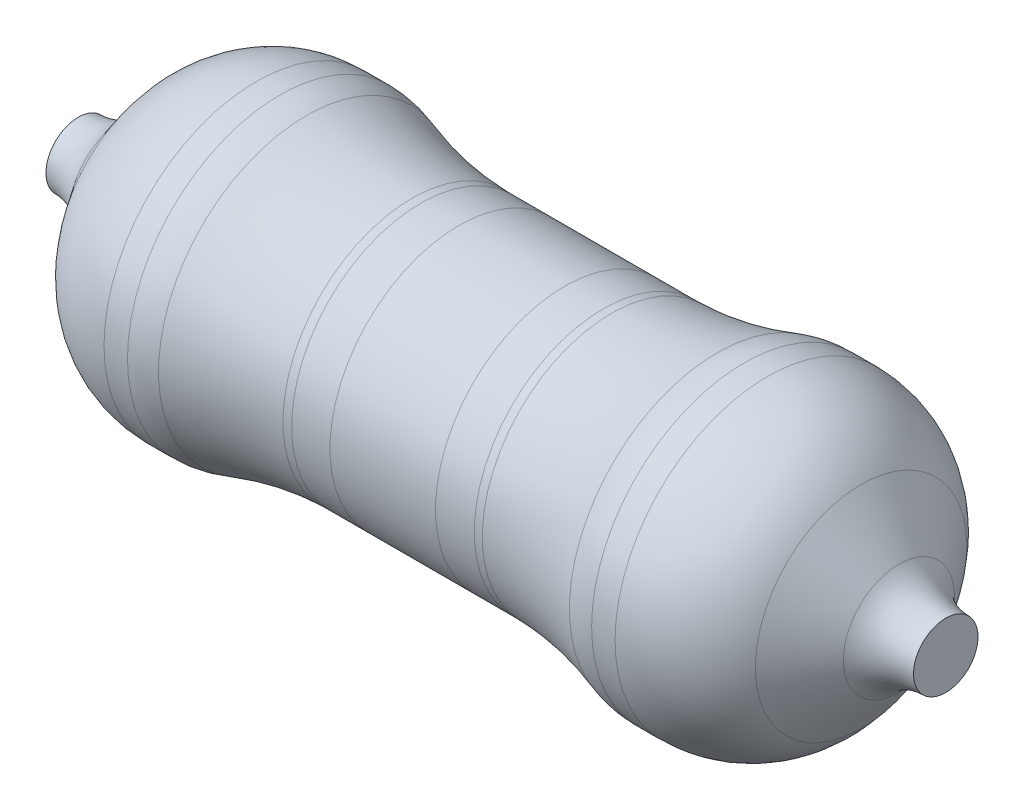
ISO-10303-21;
HEADER;
FILE_DESCRIPTION(('STEP AP214'),'2;1');
FILE_NAME('part.step','',(''),(''),'','','');
FILE_SCHEMA(('AUTOMOTIVE_DESIGN { 1 0 10303 214 1 1 1 1 }'));
ENDSEC;
DATA;
#1=APPLICATION_CONTEXT('core data for automotive mechanical design processes');
#2=APPLICATION_PROTOCOL_DEFINITION('international standard','automotive_design',2000,#1);
#3=PRODUCT_CONTEXT('',#1,'mechanical');
#4=PRODUCT('Part','Part','',(#3));
#5=PRODUCT_RELATED_PRODUCT_CATEGORY('part','',(#4));
#6=PRODUCT_DEFINITION_FORMATION('','',#4);
#7=PRODUCT_DEFINITION_CONTEXT('part definition',#1,'design');
#8=PRODUCT_DEFINITION('design','',#6,#7);
#9=PRODUCT_DEFINITION_SHAPE('','',#8);
#10=(LENGTH_UNIT() NAMED_UNIT(*) SI_UNIT(.MILLI.,.METRE.));
#11=(NAMED_UNIT(*) PLANE_ANGLE_UNIT() SI_UNIT($,.RADIAN.));
#12=(NAMED_UNIT(*) SI_UNIT($,.STERADIAN.) SOLID_ANGLE_UNIT());
#13=UNCERTAINTY_MEASURE_WITH_UNIT(LENGTH_MEASURE(1.E-05),#10,'distance_accuracy_value','');
#14=(GEOMETRIC_REPRESENTATION_CONTEXT(3) GLOBAL_UNCERTAINTY_ASSIGNED_CONTEXT((#13)) GLOBAL_UNIT_ASSIGNED_CONTEXT((#10,
#11,#12)) REPRESENTATION_CONTEXT('',''));
#15=CARTESIAN_POINT('',(0.,0.,0.));
#16=DIRECTION('',(0.,0.,1.));
#17=DIRECTION('',(1.,0.,0.));
#18=AXIS2_PLACEMENT_3D('',#15,#16,#17);
#19=CARTESIAN_POINT('',(5.85905244158813,0.,1.4));
#20=DIRECTION('',(1.,0.,0.));
#21=DIRECTION('',(0.,0.,-1.));
#22=AXIS2_PLACEMENT_3D('',#19,#20,#21);
#23=TOROIDAL_SURFACE('',#22,4.1,3.);
#24=CARTESIAN_POINT('',(6.83202541456111,0.,0.137837837837836));
#25=CARTESIAN_POINT('',(6.61399342152517,0.,0.212591664021587));
#26=CARTESIAN_POINT('',(6.38829802505005,0.,0.265011332011033));
#27=CARTESIAN_POINT('',(6.15840471411884,0.,0.293912874725487));
#28=CARTESIAN_POINT('',(5.92797458543889,0.,0.299208185186053));
#29=B_SPLINE_CURVE_WITH_KNOTS('',4,(#24,#25,#26,#27,#28),.UNSPECIFIED.,.F.,.F.,(5,5),
(2.81129529876054,3.11861658418262),.UNSPECIFIED.);
#30=CARTESIAN_POINT('',(6.83202541456111,0.,0.137837837837838));
#31=VERTEX_POINT('',#30);
#32=CARTESIAN_POINT('',(5.92797458543889,0.,0.299208185186053));
#33=VERTEX_POINT('',#32);
#34=EDGE_CURVE('E11',#31,#33,#29,.T.);
#35=ORIENTED_EDGE('',*,*,#34,.T.);
#36=CARTESIAN_POINT('',(5.92797458543889,0.,1.4));
#37=DIRECTION('',(1.,0.,0.));
#38=DIRECTION('',(0.,0.,-1.));
#39=AXIS2_PLACEMENT_3D('',#36,#37,#38);
#40=CIRCLE('',#39,1.10079181481395);
#41=EDGE_CURVE('E26',#33,#33,#40,.T.);
#42=ORIENTED_EDGE('',*,*,#41,.T.);
#43=ORIENTED_EDGE('',*,*,#34,.F.);
#44=CARTESIAN_POINT('',(6.83202541456111,0.,1.4));
#45=DIRECTION('',(1.,0.,0.));
#46=DIRECTION('',(0.,0.,-1.));
#47=AXIS2_PLACEMENT_3D('',#44,#45,#46);
#48=CIRCLE('',#47,1.26216216216216);
#49=EDGE_CURVE('E37',#31,#31,#48,.T.);
#50=ORIENTED_EDGE('',*,*,#49,.F.);
#51=EDGE_LOOP('',(#35,#42,#43,#50));
#52=FACE_BOUND('',#51,.T.);
#53=ADVANCED_FACE('F17',(#52),#23,.F.);
#54=CARTESIAN_POINT('',(5.85905244158813,0.,1.4));
#55=DIRECTION('',(1.,0.,0.));
#56=DIRECTION('',(0.,0.,-1.));
#57=AXIS2_PLACEMENT_3D('',#54,#55,#56);
#58=TOROIDAL_SURFACE('',#57,4.1,3.);
#59=CARTESIAN_POINT('',(5.92797458543889,0.,0.299208185186053));
#60=CARTESIAN_POINT('',(5.90500458029576,0.,0.299736038506322));
#61=CARTESIAN_POINT('',(5.8820285109953,0.,0.3));
#62=CARTESIAN_POINT('',(5.85905244158813,0.,0.3));
#63=B_SPLINE_CURVE_WITH_KNOTS('',3,(#59,#60,#61,#62),.UNSPECIFIED.,.F.,.F.,(4,4),
(3.11861658418262,3.14159265358979),.UNSPECIFIED.);
#64=CARTESIAN_POINT('',(5.85905244158813,0.,0.3));
#65=VERTEX_POINT('',#64);
#66=EDGE_CURVE('E250',#33,#65,#63,.T.);
#67=ORIENTED_EDGE('',*,*,#66,.T.);
#68=CARTESIAN_POINT('',(5.85905244158813,0.,1.4));
#69=DIRECTION('',(1.,0.,0.));
#70=DIRECTION('',(0.,0.,-1.));
#71=AXIS2_PLACEMENT_3D('',#68,#69,#70);
#72=CIRCLE('',#71,1.1);
#73=EDGE_CURVE('E247',#65,#65,#72,.T.);
#74=ORIENTED_EDGE('',*,*,#73,.T.);
#75=ORIENTED_EDGE('',*,*,#66,.F.);
#76=ORIENTED_EDGE('',*,*,#41,.F.);
#77=EDGE_LOOP('',(#67,#74,#75,#76));
#78=FACE_BOUND('',#77,.T.);
#79=ADVANCED_FACE('F260',(#78),#58,.F.);
#80=CARTESIAN_POINT('',(7.05905244158813,0.,1.4));
#81=DIRECTION('',(1.,0.,0.));
#82=DIRECTION('',(0.,0.,-1.));
#83=AXIS2_PLACEMENT_3D('',#80,#81,#82);
#84=DEGENERATE_TOROIDAL_SURFACE('',#83,0.600000000000001,0.7,.T.);
#85=CARTESIAN_POINT('',(7.05905244158813,0.,1.4));
#86=DIRECTION('',(1.,0.,0.));
#87=DIRECTION('',(0.,0.,-1.));
#88=AXIS2_PLACEMENT_3D('',#85,#86,#87);
#89=CIRCLE('',#88,1.3);
#90=CARTESIAN_POINT('',(7.05905244158813,0.,0.0999999999999998));
#91=VERTEX_POINT('',#90);
#92=EDGE_CURVE('E242',#91,#91,#89,.T.);
#93=ORIENTED_EDGE('',*,*,#92,.F.);
#94=CARTESIAN_POINT('',(6.83202541456111,0.,0.137837837837835));
#95=CARTESIAN_POINT('',(6.88670301721865,0.,0.119091231212392));
#96=CARTESIAN_POINT('',(6.94344647821764,0.,0.106364219777053));
#97=CARTESIAN_POINT('',(7.00125040449301,0.,0.099999999999999));
#98=CARTESIAN_POINT('',(7.05905244158813,0.,0.099999999999999));
#99=B_SPLINE_CURVE_WITH_KNOTS('',4,(#94,#95,#96,#97,#98),.UNSPECIFIED.,.F.,.F.,(5,5),
(-0.330297354829246,0.),.UNSPECIFIED.);
#100=EDGE_CURVE('E235',#31,#91,#99,.T.);
#101=ORIENTED_EDGE('',*,*,#100,.F.);
#102=ORIENTED_EDGE('',*,*,#49,.T.);
#103=ORIENTED_EDGE('',*,*,#100,.T.);
#104=EDGE_LOOP('',(#93,#101,#102,#103));
#105=FACE_BOUND('',#104,.T.);
#106=ADVANCED_FACE('F304',(#105),#84,.T.);
#107=CARTESIAN_POINT('',(4.30094755841186,0.,1.4));
#108=DIRECTION('',(1.,0.,0.));
#109=DIRECTION('',(0.,0.,-1.));
#110=AXIS2_PLACEMENT_3D('',#107,#108,#109);
#111=CYLINDRICAL_SURFACE('',#110,1.1);
#112=ORIENTED_EDGE('',*,*,#73,.F.);
#113=CARTESIAN_POINT('',(5.52797458543889,0.,0.3));
#114=CARTESIAN_POINT('',(5.85905244158813,0.,0.3));
#115=B_SPLINE_CURVE_WITH_KNOTS('',1,(#113,#114),.UNSPECIFIED.,.F.,.F.,(2,2),(1.22702702702703,
1.55810488317627),.UNSPECIFIED.);
#116=CARTESIAN_POINT('',(5.52797458543889,0.,0.3));
#117=VERTEX_POINT('',#116);
#118=EDGE_CURVE('E230',#117,#65,#115,.T.);
#119=ORIENTED_EDGE('',*,*,#118,.F.);
#120=CARTESIAN_POINT('',(5.52797458543889,0.,1.4));
#121=DIRECTION('',(1.,0.,0.));
#122=DIRECTION('',(0.,0.,-1.));
#123=AXIS2_PLACEMENT_3D('',#120,#121,#122);
#124=CIRCLE('',#123,1.1);
#125=EDGE_CURVE('E227',#117,#117,#124,.T.);
#126=ORIENTED_EDGE('',*,*,#125,.T.);
#127=ORIENTED_EDGE('',*,*,#118,.T.);
#128=EDGE_LOOP('',(#112,#119,#126,#127));
#129=FACE_BOUND('',#128,.T.);
#130=ADVANCED_FACE('F263',(#129),#111,.T.);
#131=CARTESIAN_POINT('',(7.05905244158813,0.,1.4));
#132=DIRECTION('',(1.,0.,0.));
#133=DIRECTION('',(0.,0.,-1.));
#134=AXIS2_PLACEMENT_3D('',#131,#132,#133);
#135=CYLINDRICAL_SURFACE('',#134,1.3);
#136=CARTESIAN_POINT('',(7.25905244158813,0.,1.4));
#137=DIRECTION('',(1.,0.,0.));
#138=DIRECTION('',(0.,0.,-1.));
#139=AXIS2_PLACEMENT_3D('',#136,#137,#138);
#140=CIRCLE('',#139,1.3);
#141=CARTESIAN_POINT('',(7.25905244158813,0.,0.0999999999999998));
#142=VERTEX_POINT('',#141);
#143=EDGE_CURVE('E222',#142,#142,#140,.T.);
#144=ORIENTED_EDGE('',*,*,#143,.F.);
#145=CARTESIAN_POINT('',(7.05905244158813,0.,0.0999999999999999));
#146=CARTESIAN_POINT('',(7.25905244158813,0.,0.0999999999999999));
#147=B_SPLINE_CURVE_WITH_KNOTS('',1,(#145,#146),.UNSPECIFIED.,.F.,.F.,(2,2),(0.,0.2),.UNSPECIFIED.);
#148=EDGE_CURVE('E214',#91,#142,#147,.T.);
#149=ORIENTED_EDGE('',*,*,#148,.F.);
#150=ORIENTED_EDGE('',*,*,#92,.T.);
#151=ORIENTED_EDGE('',*,*,#148,.T.);
#152=EDGE_LOOP('',(#144,#149,#150,#151));
#153=FACE_BOUND('',#152,.T.);
#154=ADVANCED_FACE('F312',(#153),#135,.T.);
#155=CARTESIAN_POINT('',(4.30094755841186,0.,1.4));
#156=DIRECTION('',(1.,0.,0.));
#157=DIRECTION('',(0.,0.,-1.));
#158=AXIS2_PLACEMENT_3D('',#155,#156,#157);
#159=CYLINDRICAL_SURFACE('',#158,1.1);
#160=ORIENTED_EDGE('',*,*,#125,.F.);
#161=CARTESIAN_POINT('',(4.62797458543889,0.,0.3));
#162=CARTESIAN_POINT('',(5.52797458543889,0.,0.3));
#163=B_SPLINE_CURVE_WITH_KNOTS('',1,(#161,#162),.UNSPECIFIED.,.F.,.F.,(2,2),(0.327027027027031,
1.22702702702703),.UNSPECIFIED.);
#164=CARTESIAN_POINT('',(4.62797458543889,0.,0.3));
#165=VERTEX_POINT('',#164);
#166=EDGE_CURVE('E209',#165,#117,#163,.T.);
#167=ORIENTED_EDGE('',*,*,#166,.F.);
#168=CARTESIAN_POINT('',(4.62797458543889,0.,1.4));
#169=DIRECTION('',(1.,0.,0.));
#170=DIRECTION('',(0.,0.,-1.));
#171=AXIS2_PLACEMENT_3D('',#168,#169,#170);
#172=CIRCLE('',#171,1.1);
#173=EDGE_CURVE('E206',#165,#165,#172,.T.);
#174=ORIENTED_EDGE('',*,*,#173,.T.);
#175=ORIENTED_EDGE('',*,*,#166,.T.);
#176=EDGE_LOOP('',(#160,#167,#174,#175));
#177=FACE_BOUND('',#176,.T.);
#178=ADVANCED_FACE('F266',(#177),#159,.T.);
#179=CARTESIAN_POINT('',(7.25905244158813,0.,1.4));
#180=DIRECTION('',(1.,0.,0.));
#181=DIRECTION('',(0.,0.,-1.));
#182=AXIS2_PLACEMENT_3D('',#179,#180,#181);
#183=DEGENERATE_TOROIDAL_SURFACE('',#182,0.300000000000001,1.,.T.);
#184=CARTESIAN_POINT('',(8.05768795163543,0.,1.4));
#185=DIRECTION('',(1.,0.,0.));
#186=DIRECTION('',(0.,0.,-1.));
#187=AXIS2_PLACEMENT_3D('',#184,#185,#186);
#188=CIRCLE('',#187,0.901815023152049);
#189=CARTESIAN_POINT('',(8.05768795163543,0.,0.498184976847952));
#190=VERTEX_POINT('',#189);
#191=EDGE_CURVE('E201',#190,#190,#188,.T.);
#192=ORIENTED_EDGE('',*,*,#191,.F.);
#193=CARTESIAN_POINT('',(7.25905244158813,0.,0.099999999999999));
#194=CARTESIAN_POINT('',(7.44405734229951,0.,0.0999999999999988));
#195=CARTESIAN_POINT('',(7.62906998362408,0.,0.142765536918089));
#196=CARTESIAN_POINT('',(7.80085175961936,0.,0.228412771028119));
#197=CARTESIAN_POINT('',(7.94634922303056,0.,0.350433493607056));
#198=CARTESIAN_POINT('',(8.05768795163543,0.,0.498184976847954));
#199=B_SPLINE_CURVE_WITH_KNOTS('',5,(#193,#194,#195,#196,#197,#198),.UNSPECIFIED.,.F.,.F.,(6,6),
(0.,0.925024503556999),.UNSPECIFIED.);
#200=EDGE_CURVE('E193',#142,#190,#199,.T.);
#201=ORIENTED_EDGE('',*,*,#200,.F.);
#202=ORIENTED_EDGE('',*,*,#143,.T.);
#203=ORIENTED_EDGE('',*,*,#200,.T.);
#204=EDGE_LOOP('',(#192,#201,#202,#203));
#205=FACE_BOUND('',#204,.T.);
#206=ADVANCED_FACE('F318',(#205),#183,.T.);
#207=CARTESIAN_POINT('',(4.30094755841186,0.,1.4));
#208=DIRECTION('',(1.,0.,0.));
#209=DIRECTION('',(0.,0.,-1.));
#210=AXIS2_PLACEMENT_3D('',#207,#208,#209);
#211=CYLINDRICAL_SURFACE('',#210,1.1);
#212=ORIENTED_EDGE('',*,*,#173,.F.);
#213=CARTESIAN_POINT('',(4.30094755841186,0.,0.3));
#214=CARTESIAN_POINT('',(4.62797458543889,0.,0.3));
#215=B_SPLINE_CURVE_WITH_KNOTS('',1,(#213,#214),.UNSPECIFIED.,.F.,.F.,(2,2),(0.,
0.327027027027031),.UNSPECIFIED.);
#216=CARTESIAN_POINT('',(4.30094755841186,0.,0.3));
#217=VERTEX_POINT('',#216);
#218=EDGE_CURVE('E188',#217,#165,#215,.T.);
#219=ORIENTED_EDGE('',*,*,#218,.F.);
#220=CARTESIAN_POINT('',(4.30094755841186,0.,1.4));
#221=DIRECTION('',(1.,0.,0.));
#222=DIRECTION('',(0.,0.,-1.));
#223=AXIS2_PLACEMENT_3D('',#220,#221,#222);
#224=CIRCLE('',#223,1.1);
#225=EDGE_CURVE('E185',#217,#217,#224,.T.);
#226=ORIENTED_EDGE('',*,*,#225,.T.);
#227=ORIENTED_EDGE('',*,*,#218,.T.);
#228=EDGE_LOOP('',(#212,#219,#226,#227));
#229=FACE_BOUND('',#228,.T.);
#230=ADVANCED_FACE('F269',(#229),#211,.T.);
#231=CARTESIAN_POINT('',(8.21884397581771,0.,1.4));
#232=DIRECTION('',(-1.,0.,0.));
#233=DIRECTION('',(0.,0.,1.));
#234=AXIS2_PLACEMENT_3D('',#231,#232,#233);
#235=CONICAL_SURFACE('',#234,0.687953755788013,0.925024503556997);
#236=CARTESIAN_POINT('',(8.38,0.,1.4));
#237=DIRECTION('',(1.,0.,0.));
#238=DIRECTION('',(0.,0.,-1.));
#239=AXIS2_PLACEMENT_3D('',#236,#237,#238);
#240=CIRCLE('',#239,0.474092488423977);
#241=CARTESIAN_POINT('',(8.38,0.,0.925907511576024));
#242=VERTEX_POINT('',#241);
#243=EDGE_CURVE('E180',#242,#242,#240,.T.);
#244=ORIENTED_EDGE('',*,*,#243,.F.);
#245=CARTESIAN_POINT('',(8.38,0.,0.925907511576025));
#246=CARTESIAN_POINT('',(8.05768795163543,0.,0.498184976847953));
#247=B_SPLINE_CURVE_WITH_KNOTS('',1,(#245,#246),.UNSPECIFIED.,.F.,.F.,(2,2),(-0.267783318764994,
0.267783318764989),.UNSPECIFIED.);
#248=EDGE_CURVE('E172',#242,#190,#247,.T.);
#249=ORIENTED_EDGE('',*,*,#248,.T.);
#250=ORIENTED_EDGE('',*,*,#191,.T.);
#251=ORIENTED_EDGE('',*,*,#248,.F.);
#252=EDGE_LOOP('',(#244,#249,#250,#251));
#253=FACE_BOUND('',#252,.T.);
#254=ADVANCED_FACE('F324',(#253),#235,.T.);
#255=CARTESIAN_POINT('',(4.30094755841186,0.,1.4));
#256=DIRECTION('',(1.,0.,0.));
#257=DIRECTION('',(0.,0.,-1.));
#258=AXIS2_PLACEMENT_3D('',#255,#256,#257);
#259=TOROIDAL_SURFACE('',#258,4.1,3.);
#260=CARTESIAN_POINT('',(4.30094755841186,0.,0.3));
#261=CARTESIAN_POINT('',(4.27662083477533,0.,0.3));
#262=CARTESIAN_POINT('',(4.2522941112808,0.,0.299704090667137));
#263=CARTESIAN_POINT('',(4.22797458543889,0.,0.299112359551654));
#264=B_SPLINE_CURVE_WITH_KNOTS('',3,(#260,#261,#262,#263),.UNSPECIFIED.,.F.,.F.,(4,4),
(3.14159265358979,3.16591937722632),.UNSPECIFIED.);
#265=CARTESIAN_POINT('',(4.22797458543889,0.,0.299112359551654));
#266=VERTEX_POINT('',#265);
#267=EDGE_CURVE('E168',#217,#266,#264,.T.);
#268=ORIENTED_EDGE('',*,*,#267,.T.);
#269=CARTESIAN_POINT('',(4.22797458543889,0.,1.4));
#270=DIRECTION('',(1.,0.,0.));
#271=DIRECTION('',(0.,0.,-1.));
#272=AXIS2_PLACEMENT_3D('',#269,#270,#271);
#273=CIRCLE('',#272,1.10088764044835);
#274=EDGE_CURVE('E162',#266,#266,#273,.T.);
#275=ORIENTED_EDGE('',*,*,#274,.T.);
#276=ORIENTED_EDGE('',*,*,#267,.F.);
#277=ORIENTED_EDGE('',*,*,#225,.F.);
#278=EDGE_LOOP('',(#268,#275,#276,#277));
#279=FACE_BOUND('',#278,.T.);
#280=ADVANCED_FACE('F273',(#279),#259,.F.);
#281=CARTESIAN_POINT('',(8.77931775502365,0.,1.4));
#282=DIRECTION('',(1.,0.,0.));
#283=DIRECTION('',(0.,0.,-1.));
#284=AXIS2_PLACEMENT_3D('',#281,#282,#283);
#285=TOROIDAL_SURFACE('',#284,0.775,0.5);
#286=CARTESIAN_POINT('',(8.77931775502365,0.,1.125));
#287=CARTESIAN_POINT('',(8.68681530466796,0.,1.125));
#288=CARTESIAN_POINT('',(8.59430898400567,0.,1.10361723154095));
#289=CARTESIAN_POINT('',(8.50841809600804,0.,1.06079361448594));
#290=CARTESIAN_POINT('',(8.43566936430242,0.,0.99978325319647));
#291=CARTESIAN_POINT('',(8.38,0.,0.925907511576022));
#292=B_SPLINE_CURVE_WITH_KNOTS('',5,(#286,#287,#288,#289,#290,#291),.UNSPECIFIED.,.F.,.F.,(6,6),
(3.14159265358979,4.06661715714679),.UNSPECIFIED.);
#293=CARTESIAN_POINT('',(8.77931775502365,0.,1.125));
#294=VERTEX_POINT('',#293);
#295=EDGE_CURVE('E157',#294,#242,#292,.T.);
#296=ORIENTED_EDGE('',*,*,#295,.T.);
#297=ORIENTED_EDGE('',*,*,#243,.T.);
#298=ORIENTED_EDGE('',*,*,#295,.F.);
#299=CARTESIAN_POINT('',(8.77931775502365,0.,1.4));
#300=DIRECTION('',(1.,0.,0.));
#301=DIRECTION('',(0.,0.,-1.));
#302=AXIS2_PLACEMENT_3D('',#299,#300,#301);
#303=CIRCLE('',#302,0.275);
#304=EDGE_CURVE('E152',#294,#294,#303,.T.);
#305=ORIENTED_EDGE('',*,*,#304,.F.);
#306=EDGE_LOOP('',(#296,#297,#298,#305));
#307=FACE_BOUND('',#306,.T.);
#308=ADVANCED_FACE('F330',(#307),#285,.F.);
#309=CARTESIAN_POINT('',(4.30094755841186,0.,1.4));
#310=DIRECTION('',(1.,0.,0.));
#311=DIRECTION('',(0.,0.,-1.));
#312=AXIS2_PLACEMENT_3D('',#309,#310,#311);
#313=TOROIDAL_SURFACE('',#312,4.1,3.);
#314=CARTESIAN_POINT('',(4.22797458543889,0.,0.299112359551654));
#315=CARTESIAN_POINT('',(3.99856451002141,0.,0.293530462901517));
#316=CARTESIAN_POINT('',(3.76971822065777,0.,0.264550127930872));
#317=CARTESIAN_POINT('',(3.54504834405535,0.,0.212263126506339));
#318=CARTESIAN_POINT('',(3.32797458543889,0.,0.137837837837839));
#319=B_SPLINE_CURVE_WITH_KNOTS('',4,(#314,#315,#316,#317,#318),.UNSPECIFIED.,.F.,.F.,(5,5),
(3.16591937722632,3.47189000841905),.UNSPECIFIED.);
#320=CARTESIAN_POINT('',(3.32797458543889,0.,0.137837837837838));
#321=VERTEX_POINT('',#320);
#322=EDGE_CURVE('E148',#266,#321,#319,.T.);
#323=ORIENTED_EDGE('',*,*,#322,.T.);
#324=CARTESIAN_POINT('',(3.32797458543889,0.,1.4));
#325=DIRECTION('',(1.,0.,0.));
#326=DIRECTION('',(0.,0.,-1.));
#327=AXIS2_PLACEMENT_3D('',#324,#325,#326);
#328=CIRCLE('',#327,1.26216216216216);
#329=EDGE_CURVE('E142',#321,#321,#328,.T.);
#330=ORIENTED_EDGE('',*,*,#329,.T.);
#331=ORIENTED_EDGE('',*,*,#322,.F.);
#332=ORIENTED_EDGE('',*,*,#274,.F.);
#333=EDGE_LOOP('',(#323,#330,#331,#332));
#334=FACE_BOUND('',#333,.T.);
#335=ADVANCED_FACE('F277',(#334),#313,.F.);
#336=CARTESIAN_POINT('',(8.77931775502365,0.,1.4));
#337=DIRECTION('',(1.,0.,0.));
#338=DIRECTION('',(0.,0.,-1.));
#339=AXIS2_PLACEMENT_3D('',#336,#337,#338);
#340=PLANE('',#339);
#341=ORIENTED_EDGE('',*,*,#304,.T.);
#342=EDGE_LOOP('',(#341));
#343=FACE_BOUND('',#342,.T.);
#344=ADVANCED_FACE('F336',(#343),#340,.T.);
#345=CARTESIAN_POINT('',(3.10094755841187,0.,1.4));
#346=DIRECTION('',(1.,0.,0.));
#347=DIRECTION('',(0.,0.,-1.));
#348=AXIS2_PLACEMENT_3D('',#345,#346,#347);
#349=DEGENERATE_TOROIDAL_SURFACE('',#348,0.600000000000001,0.7,.T.);
#350=ORIENTED_EDGE('',*,*,#329,.F.);
#351=CARTESIAN_POINT('',(3.10094755841187,0.,0.099999999999999));
#352=CARTESIAN_POINT('',(3.15874959550699,0.,0.099999999999999));
#353=CARTESIAN_POINT('',(3.21655352178236,0.,0.106364219777053));
#354=CARTESIAN_POINT('',(3.27329698278135,0.,0.119091231212392));
#355=CARTESIAN_POINT('',(3.32797458543889,0.,0.137837837837835));
#356=B_SPLINE_CURVE_WITH_KNOTS('',4,(#351,#352,#353,#354,#355),.UNSPECIFIED.,.F.,.F.,(5,5),(0.,
0.330297354829245),.UNSPECIFIED.);
#357=CARTESIAN_POINT('',(3.10094755841187,0.,0.1));
#358=VERTEX_POINT('',#357);
#359=EDGE_CURVE('E137',#358,#321,#356,.T.);
#360=ORIENTED_EDGE('',*,*,#359,.F.);
#361=CARTESIAN_POINT('',(3.10094755841187,0.,1.4));
#362=DIRECTION('',(1.,0.,0.));
#363=DIRECTION('',(0.,0.,-1.));
#364=AXIS2_PLACEMENT_3D('',#361,#362,#363);
#365=CIRCLE('',#364,1.3);
#366=EDGE_CURVE('E131',#358,#358,#365,.T.);
#367=ORIENTED_EDGE('',*,*,#366,.T.);
#368=ORIENTED_EDGE('',*,*,#359,.T.);
#369=EDGE_LOOP('',(#350,#360,#367,#368));
#370=FACE_BOUND('',#369,.T.);
#371=ADVANCED_FACE('F280',(#370),#349,.T.);
#372=CARTESIAN_POINT('',(2.90094755841187,0.,1.4));
#373=DIRECTION('',(1.,0.,0.));
#374=DIRECTION('',(0.,0.,-1.));
#375=AXIS2_PLACEMENT_3D('',#372,#373,#374);
#376=CYLINDRICAL_SURFACE('',#375,1.3);
#377=ORIENTED_EDGE('',*,*,#366,.F.);
#378=CARTESIAN_POINT('',(2.90094755841187,0.,0.0999999999999999));
#379=CARTESIAN_POINT('',(3.10094755841187,0.,0.0999999999999999));
#380=B_SPLINE_CURVE_WITH_KNOTS('',1,(#378,#379),.UNSPECIFIED.,.F.,.F.,(2,2),(0.,0.2),.UNSPECIFIED.);
#381=CARTESIAN_POINT('',(2.90094755841187,0.,0.1));
#382=VERTEX_POINT('',#381);
#383=EDGE_CURVE('E126',#382,#358,#380,.T.);
#384=ORIENTED_EDGE('',*,*,#383,.F.);
#385=CARTESIAN_POINT('',(2.90094755841187,0.,1.4));
#386=DIRECTION('',(1.,0.,0.));
#387=DIRECTION('',(0.,0.,-1.));
#388=AXIS2_PLACEMENT_3D('',#385,#386,#387);
#389=CIRCLE('',#388,1.3);
#390=EDGE_CURVE('E120',#382,#382,#389,.T.);
#391=ORIENTED_EDGE('',*,*,#390,.T.);
#392=ORIENTED_EDGE('',*,*,#383,.T.);
#393=EDGE_LOOP('',(#377,#384,#391,#392));
#394=FACE_BOUND('',#393,.T.);
#395=ADVANCED_FACE('F283',(#394),#376,.T.);
#396=CARTESIAN_POINT('',(2.90094755841187,0.,1.4));
#397=DIRECTION('',(1.,0.,0.));
#398=DIRECTION('',(0.,0.,-1.));
#399=AXIS2_PLACEMENT_3D('',#396,#397,#398);
#400=DEGENERATE_TOROIDAL_SURFACE('',#399,0.3,1.,.T.);
#401=ORIENTED_EDGE('',*,*,#390,.F.);
#402=CARTESIAN_POINT('',(2.10231204836458,0.,0.498184976847955));
#403=CARTESIAN_POINT('',(2.21365077696945,0.,0.350433493607057));
#404=CARTESIAN_POINT('',(2.35914824038062,0.,0.228412771028122));
#405=CARTESIAN_POINT('',(2.53093001637595,0.,0.142765536918089));
#406=CARTESIAN_POINT('',(2.71594265770047,0.,0.1));
#407=CARTESIAN_POINT('',(2.90094755841187,0.,0.0999999999999999));
#408=B_SPLINE_CURVE_WITH_KNOTS('',5,(#402,#403,#404,#405,#406,#407),.UNSPECIFIED.,.F.,.F.,(6,6),
(-0.925024503556999,0.),.UNSPECIFIED.);
#409=CARTESIAN_POINT('',(2.10231204836457,0.,0.498184976847952));
#410=VERTEX_POINT('',#409);
#411=EDGE_CURVE('E115',#410,#382,#408,.T.);
#412=ORIENTED_EDGE('',*,*,#411,.F.);
#413=CARTESIAN_POINT('',(2.10231204836457,0.,1.4));
#414=DIRECTION('',(1.,0.,0.));
#415=DIRECTION('',(0.,0.,-1.));
#416=AXIS2_PLACEMENT_3D('',#413,#414,#415);
#417=CIRCLE('',#416,0.901815023152049);
#418=EDGE_CURVE('E109',#410,#410,#417,.T.);
#419=ORIENTED_EDGE('',*,*,#418,.T.);
#420=ORIENTED_EDGE('',*,*,#411,.T.);
#421=EDGE_LOOP('',(#401,#412,#419,#420));
#422=FACE_BOUND('',#421,.T.);
#423=ADVANCED_FACE('F286',(#422),#400,.T.);
#424=CARTESIAN_POINT('',(1.94115602418229,0.,1.4));
#425=DIRECTION('',(1.,0.,0.));
#426=DIRECTION('',(0.,0.,-1.));
#427=AXIS2_PLACEMENT_3D('',#424,#425,#426);
#428=CONICAL_SURFACE('',#427,0.687953755788012,0.925024503556994);
#429=ORIENTED_EDGE('',*,*,#418,.F.);
#430=CARTESIAN_POINT('',(1.78,0.,0.925907511576026));
#431=CARTESIAN_POINT('',(2.10231204836457,0.,0.498184976847954));
#432=B_SPLINE_CURVE_WITH_KNOTS('',1,(#430,#431),.UNSPECIFIED.,.F.,.F.,(2,2),(-0.267783318764994,
0.267783318764989),.UNSPECIFIED.);
#433=CARTESIAN_POINT('',(1.78,0.,0.925907511576025));
#434=VERTEX_POINT('',#433);
#435=EDGE_CURVE('E96',#434,#410,#432,.T.);
#436=ORIENTED_EDGE('',*,*,#435,.F.);
#437=CARTESIAN_POINT('',(1.78,0.,1.4));
#438=DIRECTION('',(1.,0.,0.));
#439=DIRECTION('',(0.,0.,-1.));
#440=AXIS2_PLACEMENT_3D('',#437,#438,#439);
#441=CIRCLE('',#440,0.474092488423976);
#442=EDGE_CURVE('E94',#434,#434,#441,.T.);
#443=ORIENTED_EDGE('',*,*,#442,.T.);
#444=ORIENTED_EDGE('',*,*,#435,.T.);
#445=EDGE_LOOP('',(#429,#436,#443,#444));
#446=FACE_BOUND('',#445,.T.);
#447=ADVANCED_FACE('F289',(#446),#428,.T.);
#448=CARTESIAN_POINT('',(1.38068224497635,0.,1.4));
#449=DIRECTION('',(1.,0.,0.));
#450=DIRECTION('',(0.,0.,-1.));
#451=AXIS2_PLACEMENT_3D('',#448,#449,#450);
#452=TOROIDAL_SURFACE('',#451,0.775,0.5);
#453=CARTESIAN_POINT('',(1.78,0.,0.925907511576022));
#454=CARTESIAN_POINT('',(1.72433063569756,0.,0.999783253196471));
#455=CARTESIAN_POINT('',(1.65158190399198,0.,1.06079361448594));
#456=CARTESIAN_POINT('',(1.56569101599431,0.,1.10361723154096));
#457=CARTESIAN_POINT('',(1.47318469533205,0.,1.125));
#458=CARTESIAN_POINT('',(1.38068224497635,0.,1.125));
#459=B_SPLINE_CURVE_WITH_KNOTS('',5,(#453,#454,#455,#456,#457,#458),.UNSPECIFIED.,.F.,.F.,(6,6),
(2.21656815003279,3.14159265358979),.UNSPECIFIED.);
#460=CARTESIAN_POINT('',(1.38068224497635,0.,1.125));
#461=VERTEX_POINT('',#460);
#462=EDGE_CURVE('E89',#434,#461,#459,.T.);
#463=ORIENTED_EDGE('',*,*,#462,.T.);
#464=CARTESIAN_POINT('',(1.38068224497635,0.,1.4));
#465=DIRECTION('',(1.,0.,0.));
#466=DIRECTION('',(0.,0.,-1.));
#467=AXIS2_PLACEMENT_3D('',#464,#465,#466);
#468=CIRCLE('',#467,0.275);
#469=EDGE_CURVE('E92',#461,#461,#468,.T.);
#470=ORIENTED_EDGE('',*,*,#469,.T.);
#471=ORIENTED_EDGE('',*,*,#462,.F.);
#472=ORIENTED_EDGE('',*,*,#442,.F.);
#473=EDGE_LOOP('',(#463,#470,#471,#472));
#474=FACE_BOUND('',#473,.T.);
#475=ADVANCED_FACE('F90',(#474),#452,.F.);
#476=CARTESIAN_POINT('',(1.38068224497635,0.,1.4));
#477=DIRECTION('',(-1.,0.,0.));
#478=DIRECTION('',(0.,0.,-1.));
#479=AXIS2_PLACEMENT_3D('',#476,#477,#478);
#480=PLANE('',#479);
#481=ORIENTED_EDGE('',*,*,#469,.F.);
#482=EDGE_LOOP('',(#481));
#483=FACE_BOUND('',#482,.T.);
#484=ADVANCED_FACE('F297',(#483),#480,.T.);
#485=CLOSED_SHELL('',(#53,#79,#106,#130,#154,#178,#206,#230,#254,#280,#308,#335,#344,#371,#395,
#423,#447,#475,#484));
#486=MANIFOLD_SOLID_BREP('B1',#485);
#487=ADVANCED_BREP_SHAPE_REPRESENTATION('',(#18,#486),#14);
#488=SHAPE_DEFINITION_REPRESENTATION(#9,#487);
ENDSEC;
END-ISO-10303-21;
